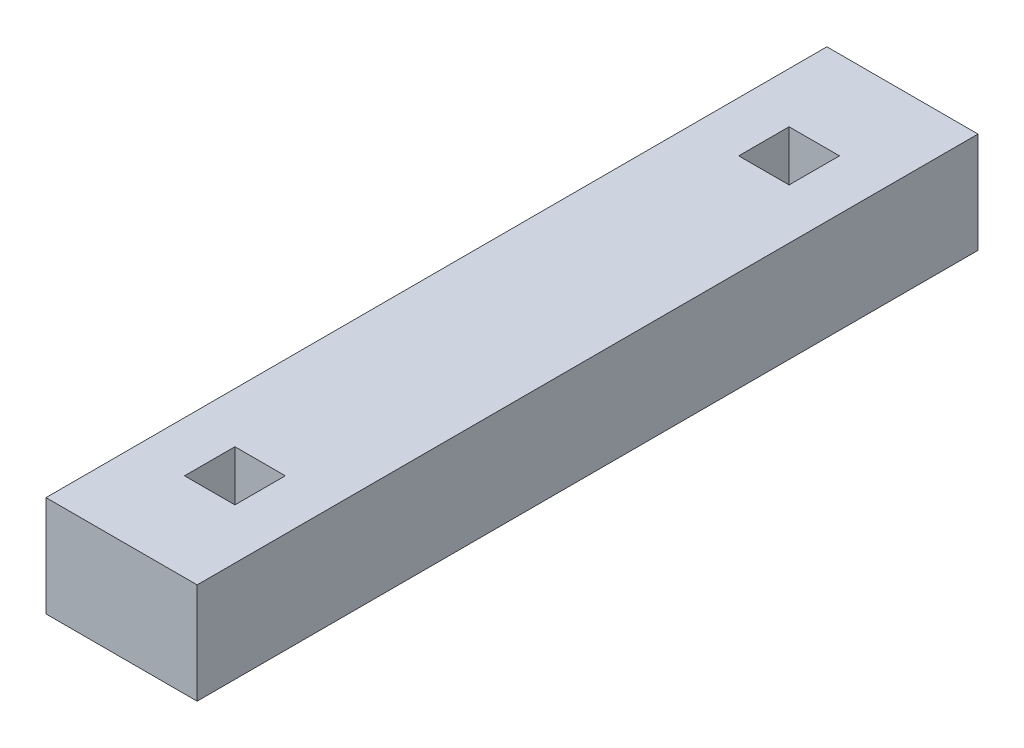
ISO-10303-21;
HEADER;
FILE_DESCRIPTION(('STEP AP214'),'2;1');
FILE_NAME('part.step','',(''),(''),'','','');
FILE_SCHEMA(('AUTOMOTIVE_DESIGN { 1 0 10303 214 1 1 1 1 }'));
ENDSEC;
DATA;
#1=APPLICATION_CONTEXT('core data for automotive mechanical design processes');
#2=APPLICATION_PROTOCOL_DEFINITION('international standard','automotive_design',2000,#1);
#3=PRODUCT_CONTEXT('',#1,'mechanical');
#4=PRODUCT('Part','Part','',(#3));
#5=PRODUCT_RELATED_PRODUCT_CATEGORY('part','',(#4));
#6=PRODUCT_DEFINITION_FORMATION('','',#4);
#7=PRODUCT_DEFINITION_CONTEXT('part definition',#1,'design');
#8=PRODUCT_DEFINITION('design','',#6,#7);
#9=PRODUCT_DEFINITION_SHAPE('','',#8);
#10=(LENGTH_UNIT() NAMED_UNIT(*) SI_UNIT(.MILLI.,.METRE.));
#11=(NAMED_UNIT(*) PLANE_ANGLE_UNIT() SI_UNIT($,.RADIAN.));
#12=(NAMED_UNIT(*) SI_UNIT($,.STERADIAN.) SOLID_ANGLE_UNIT());
#13=UNCERTAINTY_MEASURE_WITH_UNIT(LENGTH_MEASURE(1.E-05),#10,'distance_accuracy_value','');
#14=(GEOMETRIC_REPRESENTATION_CONTEXT(3) GLOBAL_UNCERTAINTY_ASSIGNED_CONTEXT((#13)) GLOBAL_UNIT_ASSIGNED_CONTEXT((#10,
#11,#12)) REPRESENTATION_CONTEXT('',''));
#15=CARTESIAN_POINT('',(0.,0.,0.));
#16=DIRECTION('',(0.,0.,1.));
#17=DIRECTION('',(1.,0.,0.));
#18=AXIS2_PLACEMENT_3D('',#15,#16,#17);
#19=CARTESIAN_POINT('',(0.,20.,0.));
#20=DIRECTION('',(0.,1.,0.));
#21=DIRECTION('',(0.,0.,1.));
#22=AXIS2_PLACEMENT_3D('',#19,#20,#21);
#23=PLANE('',#22);
#24=DIRECTION('',(0.,0.,1.));
#25=VECTOR('',#24,1.);
#26=CARTESIAN_POINT('',(-15.,20.,-72.5));
#27=LINE('',#26,#25);
#28=CARTESIAN_POINT('',(-15.,20.,-72.5));
#29=VERTEX_POINT('',#28);
#30=CARTESIAN_POINT('',(-15.,20.,82.5));
#31=VERTEX_POINT('',#30);
#32=EDGE_CURVE('E189',#29,#31,#27,.T.);
#33=ORIENTED_EDGE('',*,*,#32,.T.);
#34=DIRECTION('',(1.,0.,0.));
#35=VECTOR('',#34,1.);
#36=CARTESIAN_POINT('',(-15.,20.,82.5));
#37=LINE('',#36,#35);
#38=CARTESIAN_POINT('',(15.,20.,82.5));
#39=VERTEX_POINT('',#38);
#40=EDGE_CURVE('E192',#31,#39,#37,.T.);
#41=ORIENTED_EDGE('',*,*,#40,.T.);
#42=DIRECTION('',(0.,0.,-1.));
#43=VECTOR('',#42,1.);
#44=CARTESIAN_POINT('',(15.,20.,-72.5));
#45=LINE('',#44,#43);
#46=CARTESIAN_POINT('',(15.,20.,-72.5));
#47=VERTEX_POINT('',#46);
#48=EDGE_CURVE('E195',#39,#47,#45,.T.);
#49=ORIENTED_EDGE('',*,*,#48,.T.);
#50=DIRECTION('',(-1.,0.,0.));
#51=VECTOR('',#50,1.);
#52=CARTESIAN_POINT('',(-15.,20.,-72.5));
#53=LINE('',#52,#51);
#54=EDGE_CURVE('E197',#47,#29,#53,.T.);
#55=ORIENTED_EDGE('',*,*,#54,.T.);
#56=EDGE_LOOP('',(#33,#41,#49,#55));
#57=FACE_BOUND('',#56,.T.);
#58=DIRECTION('',(1.,0.,0.));
#59=VECTOR('',#58,1.);
#60=CARTESIAN_POINT('',(-5.,20.,-45.));
#61=LINE('',#60,#59);
#62=CARTESIAN_POINT('',(-5.,20.,-45.));
#63=VERTEX_POINT('',#62);
#64=CARTESIAN_POINT('',(5.,20.,-45.));
#65=VERTEX_POINT('',#64);
#66=EDGE_CURVE('E160',#63,#65,#61,.T.);
#67=ORIENTED_EDGE('',*,*,#66,.F.);
#68=DIRECTION('',(0.,0.,1.));
#69=VECTOR('',#68,1.);
#70=CARTESIAN_POINT('',(-5.,20.,-55.));
#71=LINE('',#70,#69);
#72=CARTESIAN_POINT('',(-5.,20.,-55.));
#73=VERTEX_POINT('',#72);
#74=EDGE_CURVE('E158',#73,#63,#71,.T.);
#75=ORIENTED_EDGE('',*,*,#74,.F.);
#76=DIRECTION('',(-1.,0.,0.));
#77=VECTOR('',#76,1.);
#78=CARTESIAN_POINT('',(-5.,20.,-55.));
#79=LINE('',#78,#77);
#80=CARTESIAN_POINT('',(5.,20.,-55.));
#81=VERTEX_POINT('',#80);
#82=EDGE_CURVE('E166',#81,#73,#79,.T.);
#83=ORIENTED_EDGE('',*,*,#82,.F.);
#84=DIRECTION('',(0.,0.,-1.));
#85=VECTOR('',#84,1.);
#86=CARTESIAN_POINT('',(5.,20.,-55.));
#87=LINE('',#86,#85);
#88=EDGE_CURVE('E163',#65,#81,#87,.T.);
#89=ORIENTED_EDGE('',*,*,#88,.F.);
#90=EDGE_LOOP('',(#67,#75,#83,#89));
#91=FACE_BOUND('',#90,.T.);
#92=DIRECTION('',(0.,0.,-1.));
#93=VECTOR('',#92,1.);
#94=CARTESIAN_POINT('',(5.,20.,65.));
#95=LINE('',#94,#93);
#96=CARTESIAN_POINT('',(5.,20.,65.));
#97=VERTEX_POINT('',#96);
#98=CARTESIAN_POINT('',(5.,20.,55.));
#99=VERTEX_POINT('',#98);
#100=EDGE_CURVE('E130',#97,#99,#95,.T.);
#101=ORIENTED_EDGE('',*,*,#100,.F.);
#102=DIRECTION('',(1.,0.,0.));
#103=VECTOR('',#102,1.);
#104=CARTESIAN_POINT('',(-5.,20.,65.));
#105=LINE('',#104,#103);
#106=CARTESIAN_POINT('',(-5.,20.,65.));
#107=VERTEX_POINT('',#106);
#108=EDGE_CURVE('E122',#107,#97,#105,.T.);
#109=ORIENTED_EDGE('',*,*,#108,.F.);
#110=DIRECTION('',(0.,0.,1.));
#111=VECTOR('',#110,1.);
#112=CARTESIAN_POINT('',(-5.,20.,65.));
#113=LINE('',#112,#111);
#114=CARTESIAN_POINT('',(-5.,20.,55.));
#115=VERTEX_POINT('',#114);
#116=EDGE_CURVE('E144',#115,#107,#113,.T.);
#117=ORIENTED_EDGE('',*,*,#116,.F.);
#118=DIRECTION('',(-1.,0.,0.));
#119=VECTOR('',#118,1.);
#120=CARTESIAN_POINT('',(-5.,20.,55.));
#121=LINE('',#120,#119);
#122=EDGE_CURVE('E142',#99,#115,#121,.T.);
#123=ORIENTED_EDGE('',*,*,#122,.F.);
#124=EDGE_LOOP('',(#101,#109,#117,#123));
#125=FACE_BOUND('',#124,.T.);
#126=ADVANCED_FACE('F33',(#57,#91,#125),#23,.T.);
#127=CARTESIAN_POINT('',(0.,0.,0.));
#128=DIRECTION('',(0.,1.,0.));
#129=DIRECTION('',(0.,0.,1.));
#130=AXIS2_PLACEMENT_3D('',#127,#128,#129);
#131=PLANE('',#130);
#132=DIRECTION('',(0.,0.,1.));
#133=VECTOR('',#132,1.);
#134=CARTESIAN_POINT('',(-5.,0.,-55.));
#135=LINE('',#134,#133);
#136=CARTESIAN_POINT('',(-5.,0.,-55.));
#137=VERTEX_POINT('',#136);
#138=CARTESIAN_POINT('',(-5.,0.,-45.));
#139=VERTEX_POINT('',#138);
#140=EDGE_CURVE('E138',#137,#139,#135,.T.);
#141=ORIENTED_EDGE('',*,*,#140,.T.);
#142=DIRECTION('',(1.,0.,0.));
#143=VECTOR('',#142,1.);
#144=CARTESIAN_POINT('',(-5.,0.,-45.));
#145=LINE('',#144,#143);
#146=CARTESIAN_POINT('',(5.,0.,-45.));
#147=VERTEX_POINT('',#146);
#148=EDGE_CURVE('E171',#139,#147,#145,.T.);
#149=ORIENTED_EDGE('',*,*,#148,.T.);
#150=DIRECTION('',(0.,0.,-1.));
#151=VECTOR('',#150,1.);
#152=CARTESIAN_POINT('',(5.,0.,-55.));
#153=LINE('',#152,#151);
#154=CARTESIAN_POINT('',(5.,0.,-55.));
#155=VERTEX_POINT('',#154);
#156=EDGE_CURVE('E174',#147,#155,#153,.T.);
#157=ORIENTED_EDGE('',*,*,#156,.T.);
#158=DIRECTION('',(-1.,0.,0.));
#159=VECTOR('',#158,1.);
#160=CARTESIAN_POINT('',(-5.,0.,-55.));
#161=LINE('',#160,#159);
#162=EDGE_CURVE('E161',#155,#137,#161,.T.);
#163=ORIENTED_EDGE('',*,*,#162,.T.);
#164=EDGE_LOOP('',(#141,#149,#157,#163));
#165=FACE_BOUND('',#164,.T.);
#166=DIRECTION('',(0.,0.,1.));
#167=VECTOR('',#166,1.);
#168=CARTESIAN_POINT('',(-15.,0.,-72.5));
#169=LINE('',#168,#167);
#170=CARTESIAN_POINT('',(-15.,0.,-72.5));
#171=VERTEX_POINT('',#170);
#172=CARTESIAN_POINT('',(-15.,0.,82.5));
#173=VERTEX_POINT('',#172);
#174=EDGE_CURVE('E188',#171,#173,#169,.T.);
#175=ORIENTED_EDGE('',*,*,#174,.F.);
#176=DIRECTION('',(-1.,0.,0.));
#177=VECTOR('',#176,1.);
#178=CARTESIAN_POINT('',(-15.,0.,-72.5));
#179=LINE('',#178,#177);
#180=CARTESIAN_POINT('',(15.,0.,-72.5));
#181=VERTEX_POINT('',#180);
#182=EDGE_CURVE('E193',#181,#171,#179,.T.);
#183=ORIENTED_EDGE('',*,*,#182,.F.);
#184=DIRECTION('',(0.,0.,-1.));
#185=VECTOR('',#184,1.);
#186=CARTESIAN_POINT('',(15.,0.,-72.5));
#187=LINE('',#186,#185);
#188=CARTESIAN_POINT('',(15.,0.,82.5));
#189=VERTEX_POINT('',#188);
#190=EDGE_CURVE('E204',#189,#181,#187,.T.);
#191=ORIENTED_EDGE('',*,*,#190,.F.);
#192=DIRECTION('',(1.,0.,0.));
#193=VECTOR('',#192,1.);
#194=CARTESIAN_POINT('',(-15.,0.,82.5));
#195=LINE('',#194,#193);
#196=EDGE_CURVE('E202',#173,#189,#195,.T.);
#197=ORIENTED_EDGE('',*,*,#196,.F.);
#198=EDGE_LOOP('',(#175,#183,#191,#197));
#199=FACE_BOUND('',#198,.T.);
#200=DIRECTION('',(1.,0.,0.));
#201=VECTOR('',#200,1.);
#202=CARTESIAN_POINT('',(-5.,0.,65.));
#203=LINE('',#202,#201);
#204=CARTESIAN_POINT('',(-5.,0.,65.));
#205=VERTEX_POINT('',#204);
#206=CARTESIAN_POINT('',(5.,0.,65.));
#207=VERTEX_POINT('',#206);
#208=EDGE_CURVE('E56',#205,#207,#203,.T.);
#209=ORIENTED_EDGE('',*,*,#208,.T.);
#210=DIRECTION('',(0.,0.,-1.));
#211=VECTOR('',#210,1.);
#212=CARTESIAN_POINT('',(5.,0.,65.));
#213=LINE('',#212,#211);
#214=CARTESIAN_POINT('',(5.,0.,55.));
#215=VERTEX_POINT('',#214);
#216=EDGE_CURVE('E137',#207,#215,#213,.T.);
#217=ORIENTED_EDGE('',*,*,#216,.T.);
#218=DIRECTION('',(-1.,0.,0.));
#219=VECTOR('',#218,1.);
#220=CARTESIAN_POINT('',(-5.,0.,55.));
#221=LINE('',#220,#219);
#222=CARTESIAN_POINT('',(-5.,0.,55.));
#223=VERTEX_POINT('',#222);
#224=EDGE_CURVE('E150',#215,#223,#221,.T.);
#225=ORIENTED_EDGE('',*,*,#224,.T.);
#226=DIRECTION('',(0.,0.,1.));
#227=VECTOR('',#226,1.);
#228=CARTESIAN_POINT('',(-5.,0.,65.));
#229=LINE('',#228,#227);
#230=EDGE_CURVE('E131',#223,#205,#229,.T.);
#231=ORIENTED_EDGE('',*,*,#230,.T.);
#232=EDGE_LOOP('',(#209,#217,#225,#231));
#233=FACE_BOUND('',#232,.T.);
#234=ADVANCED_FACE('F222',(#165,#199,#233),#131,.F.);
#235=CARTESIAN_POINT('',(-15.,20.,-72.5));
#236=DIRECTION('',(1.,0.,0.));
#237=DIRECTION('',(0.,0.,-1.));
#238=AXIS2_PLACEMENT_3D('',#235,#236,#237);
#239=PLANE('',#238);
#240=ORIENTED_EDGE('',*,*,#174,.T.);
#241=DIRECTION('',(0.,-1.,0.));
#242=VECTOR('',#241,1.);
#243=CARTESIAN_POINT('',(-15.,20.,82.5));
#244=LINE('',#243,#242);
#245=EDGE_CURVE('E11',#31,#173,#244,.T.);
#246=ORIENTED_EDGE('',*,*,#245,.F.);
#247=ORIENTED_EDGE('',*,*,#32,.F.);
#248=DIRECTION('',(0.,-1.,0.));
#249=VECTOR('',#248,1.);
#250=CARTESIAN_POINT('',(-15.,20.,-72.5));
#251=LINE('',#250,#249);
#252=EDGE_CURVE('E199',#29,#171,#251,.T.);
#253=ORIENTED_EDGE('',*,*,#252,.T.);
#254=EDGE_LOOP('',(#240,#246,#247,#253));
#255=FACE_BOUND('',#254,.T.);
#256=ADVANCED_FACE('F35',(#255),#239,.F.);
#257=CARTESIAN_POINT('',(-15.,20.,82.5));
#258=DIRECTION('',(0.,0.,-1.));
#259=DIRECTION('',(-1.,0.,0.));
#260=AXIS2_PLACEMENT_3D('',#257,#258,#259);
#261=PLANE('',#260);
#262=ORIENTED_EDGE('',*,*,#196,.T.);
#263=DIRECTION('',(0.,-1.,0.));
#264=VECTOR('',#263,1.);
#265=CARTESIAN_POINT('',(15.,20.,82.5));
#266=LINE('',#265,#264);
#267=EDGE_CURVE('E41',#39,#189,#266,.T.);
#268=ORIENTED_EDGE('',*,*,#267,.F.);
#269=ORIENTED_EDGE('',*,*,#40,.F.);
#270=ORIENTED_EDGE('',*,*,#245,.T.);
#271=EDGE_LOOP('',(#262,#268,#269,#270));
#272=FACE_BOUND('',#271,.T.);
#273=ADVANCED_FACE('F233',(#272),#261,.F.);
#274=CARTESIAN_POINT('',(15.,20.,-72.5));
#275=DIRECTION('',(-1.,0.,0.));
#276=DIRECTION('',(0.,0.,1.));
#277=AXIS2_PLACEMENT_3D('',#274,#275,#276);
#278=PLANE('',#277);
#279=ORIENTED_EDGE('',*,*,#190,.T.);
#280=DIRECTION('',(0.,-1.,0.));
#281=VECTOR('',#280,1.);
#282=CARTESIAN_POINT('',(15.,20.,-72.5));
#283=LINE('',#282,#281);
#284=EDGE_CURVE('E209',#47,#181,#283,.T.);
#285=ORIENTED_EDGE('',*,*,#284,.F.);
#286=ORIENTED_EDGE('',*,*,#48,.F.);
#287=ORIENTED_EDGE('',*,*,#267,.T.);
#288=EDGE_LOOP('',(#279,#285,#286,#287));
#289=FACE_BOUND('',#288,.T.);
#290=ADVANCED_FACE('F216',(#289),#278,.F.);
#291=CARTESIAN_POINT('',(-15.,20.,-72.5));
#292=DIRECTION('',(0.,0.,1.));
#293=DIRECTION('',(1.,0.,0.));
#294=AXIS2_PLACEMENT_3D('',#291,#292,#293);
#295=PLANE('',#294);
#296=ORIENTED_EDGE('',*,*,#182,.T.);
#297=ORIENTED_EDGE('',*,*,#252,.F.);
#298=ORIENTED_EDGE('',*,*,#54,.F.);
#299=ORIENTED_EDGE('',*,*,#284,.T.);
#300=EDGE_LOOP('',(#296,#297,#298,#299));
#301=FACE_BOUND('',#300,.T.);
#302=ADVANCED_FACE('F226',(#301),#295,.F.);
#303=CARTESIAN_POINT('',(-5.,20.,-55.));
#304=DIRECTION('',(1.,0.,0.));
#305=DIRECTION('',(0.,0.,-1.));
#306=AXIS2_PLACEMENT_3D('',#303,#304,#305);
#307=PLANE('',#306);
#308=ORIENTED_EDGE('',*,*,#140,.F.);
#309=DIRECTION('',(0.,-1.,0.));
#310=VECTOR('',#309,1.);
#311=CARTESIAN_POINT('',(-5.,20.,-55.));
#312=LINE('',#311,#310);
#313=EDGE_CURVE('E168',#73,#137,#312,.T.);
#314=ORIENTED_EDGE('',*,*,#313,.F.);
#315=ORIENTED_EDGE('',*,*,#74,.T.);
#316=DIRECTION('',(0.,-1.,0.));
#317=VECTOR('',#316,1.);
#318=CARTESIAN_POINT('',(-5.,20.,-45.));
#319=LINE('',#318,#317);
#320=EDGE_CURVE('E185',#63,#139,#319,.T.);
#321=ORIENTED_EDGE('',*,*,#320,.T.);
#322=EDGE_LOOP('',(#308,#314,#315,#321));
#323=FACE_BOUND('',#322,.T.);
#324=ADVANCED_FACE('F248',(#323),#307,.T.);
#325=CARTESIAN_POINT('',(-5.,20.,-45.));
#326=DIRECTION('',(0.,0.,-1.));
#327=DIRECTION('',(-1.,0.,0.));
#328=AXIS2_PLACEMENT_3D('',#325,#326,#327);
#329=PLANE('',#328);
#330=ORIENTED_EDGE('',*,*,#148,.F.);
#331=ORIENTED_EDGE('',*,*,#320,.F.);
#332=ORIENTED_EDGE('',*,*,#66,.T.);
#333=DIRECTION('',(0.,-1.,0.));
#334=VECTOR('',#333,1.);
#335=CARTESIAN_POINT('',(5.,20.,-45.));
#336=LINE('',#335,#334);
#337=EDGE_CURVE('E183',#65,#147,#336,.T.);
#338=ORIENTED_EDGE('',*,*,#337,.T.);
#339=EDGE_LOOP('',(#330,#331,#332,#338));
#340=FACE_BOUND('',#339,.T.);
#341=ADVANCED_FACE('F255',(#340),#329,.T.);
#342=CARTESIAN_POINT('',(5.,20.,-55.));
#343=DIRECTION('',(-1.,0.,0.));
#344=DIRECTION('',(0.,0.,1.));
#345=AXIS2_PLACEMENT_3D('',#342,#343,#344);
#346=PLANE('',#345);
#347=ORIENTED_EDGE('',*,*,#156,.F.);
#348=ORIENTED_EDGE('',*,*,#337,.F.);
#349=ORIENTED_EDGE('',*,*,#88,.T.);
#350=DIRECTION('',(0.,-1.,0.));
#351=VECTOR('',#350,1.);
#352=CARTESIAN_POINT('',(5.,20.,-55.));
#353=LINE('',#352,#351);
#354=EDGE_CURVE('E181',#81,#155,#353,.T.);
#355=ORIENTED_EDGE('',*,*,#354,.T.);
#356=EDGE_LOOP('',(#347,#348,#349,#355));
#357=FACE_BOUND('',#356,.T.);
#358=ADVANCED_FACE('F260',(#357),#346,.T.);
#359=CARTESIAN_POINT('',(-5.,20.,-55.));
#360=DIRECTION('',(0.,0.,1.));
#361=DIRECTION('',(1.,0.,0.));
#362=AXIS2_PLACEMENT_3D('',#359,#360,#361);
#363=PLANE('',#362);
#364=ORIENTED_EDGE('',*,*,#162,.F.);
#365=ORIENTED_EDGE('',*,*,#354,.F.);
#366=ORIENTED_EDGE('',*,*,#82,.T.);
#367=ORIENTED_EDGE('',*,*,#313,.T.);
#368=EDGE_LOOP('',(#364,#365,#366,#367));
#369=FACE_BOUND('',#368,.T.);
#370=ADVANCED_FACE('F267',(#369),#363,.T.);
#371=CARTESIAN_POINT('',(-5.,20.,65.));
#372=DIRECTION('',(0.,0.,-1.));
#373=DIRECTION('',(-1.,0.,0.));
#374=AXIS2_PLACEMENT_3D('',#371,#372,#373);
#375=PLANE('',#374);
#376=ORIENTED_EDGE('',*,*,#208,.F.);
#377=DIRECTION('',(0.,-1.,0.));
#378=VECTOR('',#377,1.);
#379=CARTESIAN_POINT('',(-5.,20.,65.));
#380=LINE('',#379,#378);
#381=EDGE_CURVE('E126',#107,#205,#380,.T.);
#382=ORIENTED_EDGE('',*,*,#381,.F.);
#383=ORIENTED_EDGE('',*,*,#108,.T.);
#384=DIRECTION('',(0.,-1.,0.));
#385=VECTOR('',#384,1.);
#386=CARTESIAN_POINT('',(5.,20.,65.));
#387=LINE('',#386,#385);
#388=EDGE_CURVE('E125',#97,#207,#387,.T.);
#389=ORIENTED_EDGE('',*,*,#388,.T.);
#390=EDGE_LOOP('',(#376,#382,#383,#389));
#391=FACE_BOUND('',#390,.T.);
#392=ADVANCED_FACE('F124',(#391),#375,.T.);
#393=CARTESIAN_POINT('',(5.,20.,65.));
#394=DIRECTION('',(-1.,0.,0.));
#395=DIRECTION('',(0.,0.,1.));
#396=AXIS2_PLACEMENT_3D('',#393,#394,#395);
#397=PLANE('',#396);
#398=ORIENTED_EDGE('',*,*,#216,.F.);
#399=ORIENTED_EDGE('',*,*,#388,.F.);
#400=ORIENTED_EDGE('',*,*,#100,.T.);
#401=DIRECTION('',(0.,-1.,0.));
#402=VECTOR('',#401,1.);
#403=CARTESIAN_POINT('',(5.,20.,55.));
#404=LINE('',#403,#402);
#405=EDGE_CURVE('E139',#99,#215,#404,.T.);
#406=ORIENTED_EDGE('',*,*,#405,.T.);
#407=EDGE_LOOP('',(#398,#399,#400,#406));
#408=FACE_BOUND('',#407,.T.);
#409=ADVANCED_FACE('F134',(#408),#397,.T.);
#410=CARTESIAN_POINT('',(-5.,20.,55.));
#411=DIRECTION('',(0.,0.,1.));
#412=DIRECTION('',(1.,0.,0.));
#413=AXIS2_PLACEMENT_3D('',#410,#411,#412);
#414=PLANE('',#413);
#415=ORIENTED_EDGE('',*,*,#224,.F.);
#416=ORIENTED_EDGE('',*,*,#405,.F.);
#417=ORIENTED_EDGE('',*,*,#122,.T.);
#418=DIRECTION('',(0.,-1.,0.));
#419=VECTOR('',#418,1.);
#420=CARTESIAN_POINT('',(-5.,20.,55.));
#421=LINE('',#420,#419);
#422=EDGE_CURVE('E48',#115,#223,#421,.T.);
#423=ORIENTED_EDGE('',*,*,#422,.T.);
#424=EDGE_LOOP('',(#415,#416,#417,#423));
#425=FACE_BOUND('',#424,.T.);
#426=ADVANCED_FACE('F285',(#425),#414,.T.);
#427=CARTESIAN_POINT('',(-5.,20.,65.));
#428=DIRECTION('',(1.,0.,0.));
#429=DIRECTION('',(0.,0.,-1.));
#430=AXIS2_PLACEMENT_3D('',#427,#428,#429);
#431=PLANE('',#430);
#432=ORIENTED_EDGE('',*,*,#230,.F.);
#433=ORIENTED_EDGE('',*,*,#422,.F.);
#434=ORIENTED_EDGE('',*,*,#116,.T.);
#435=ORIENTED_EDGE('',*,*,#381,.T.);
#436=EDGE_LOOP('',(#432,#433,#434,#435));
#437=FACE_BOUND('',#436,.T.);
#438=ADVANCED_FACE('F288',(#437),#431,.T.);
#439=CLOSED_SHELL('',(#126,#234,#256,#273,#290,#302,#324,#341,#358,#370,#392,#409,#426,#438));
#440=MANIFOLD_SOLID_BREP('B2',#439);
#441=ADVANCED_BREP_SHAPE_REPRESENTATION('',(#18,#440),#14);
#442=SHAPE_DEFINITION_REPRESENTATION(#9,#441);
ENDSEC;
END-ISO-10303-21;
